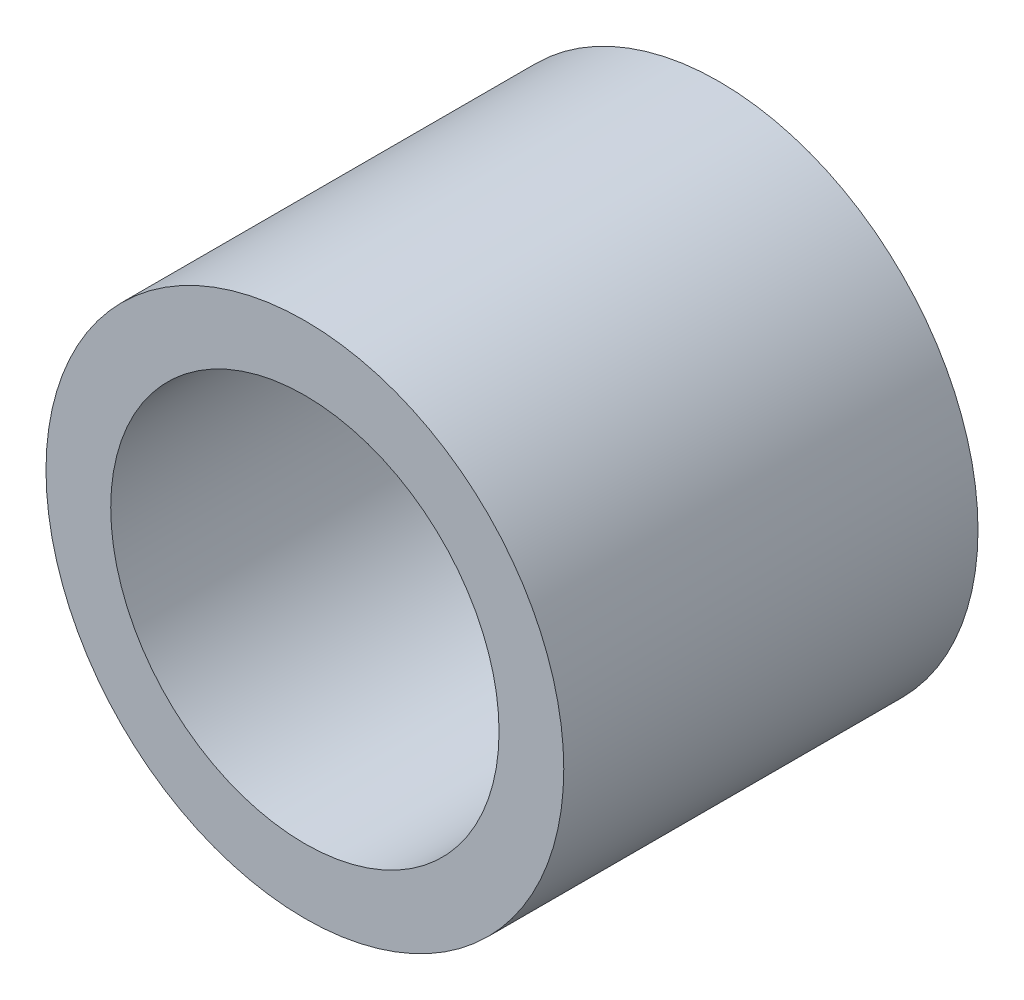
ISO-10303-21;
HEADER;
FILE_DESCRIPTION(('STEP AP214'),'2;1');
FILE_NAME('part.step','',(''),(''),'','','');
FILE_SCHEMA(('AUTOMOTIVE_DESIGN { 1 0 10303 214 1 1 1 1 }'));
ENDSEC;
DATA;
#1=APPLICATION_CONTEXT('core data for automotive mechanical design processes');
#2=APPLICATION_PROTOCOL_DEFINITION('international standard','automotive_design',2000,#1);
#3=PRODUCT_CONTEXT('',#1,'mechanical');
#4=PRODUCT('Part','Part','',(#3));
#5=PRODUCT_RELATED_PRODUCT_CATEGORY('part','',(#4));
#6=PRODUCT_DEFINITION_FORMATION('','',#4);
#7=PRODUCT_DEFINITION_CONTEXT('part definition',#1,'design');
#8=PRODUCT_DEFINITION('design','',#6,#7);
#9=PRODUCT_DEFINITION_SHAPE('','',#8);
#10=(LENGTH_UNIT() NAMED_UNIT(*) SI_UNIT(.MILLI.,.METRE.));
#11=(NAMED_UNIT(*) PLANE_ANGLE_UNIT() SI_UNIT($,.RADIAN.));
#12=(NAMED_UNIT(*) SI_UNIT($,.STERADIAN.) SOLID_ANGLE_UNIT());
#13=UNCERTAINTY_MEASURE_WITH_UNIT(LENGTH_MEASURE(1.E-05),#10,'distance_accuracy_value','');
#14=(GEOMETRIC_REPRESENTATION_CONTEXT(3) GLOBAL_UNCERTAINTY_ASSIGNED_CONTEXT((#13)) GLOBAL_UNIT_ASSIGNED_CONTEXT((#10,
#11,#12)) REPRESENTATION_CONTEXT('',''));
#15=CARTESIAN_POINT('',(0.,0.,0.));
#16=DIRECTION('',(0.,0.,1.));
#17=DIRECTION('',(1.,0.,0.));
#18=AXIS2_PLACEMENT_3D('',#15,#16,#17);
#19=CARTESIAN_POINT('',(0.,0.,3.2));
#20=DIRECTION('',(0.,0.,-1.));
#21=DIRECTION('',(-1.,0.,0.));
#22=AXIS2_PLACEMENT_3D('',#19,#20,#21);
#23=CYLINDRICAL_SURFACE('',#22,1.5);
#24=CARTESIAN_POINT('',(0.,0.,3.2));
#25=DIRECTION('',(0.,0.,1.));
#26=DIRECTION('',(1.,0.,0.));
#27=AXIS2_PLACEMENT_3D('',#24,#25,#26);
#28=CIRCLE('',#27,1.5);
#29=CARTESIAN_POINT('',(1.5,0.,3.2));
#30=VERTEX_POINT('',#29);
#31=EDGE_CURVE('E53',#30,#30,#28,.T.);
#32=ORIENTED_EDGE('',*,*,#31,.T.);
#33=EDGE_LOOP('',(#32));
#34=FACE_BOUND('',#33,.T.);
#35=CARTESIAN_POINT('',(0.,0.,0.));
#36=DIRECTION('',(0.,0.,1.));
#37=DIRECTION('',(1.,0.,0.));
#38=AXIS2_PLACEMENT_3D('',#35,#36,#37);
#39=CIRCLE('',#38,1.5);
#40=CARTESIAN_POINT('',(1.5,0.,0.));
#41=VERTEX_POINT('',#40);
#42=EDGE_CURVE('E60',#41,#41,#39,.T.);
#43=ORIENTED_EDGE('',*,*,#42,.F.);
#44=EDGE_LOOP('',(#43));
#45=FACE_BOUND('',#44,.T.);
#46=ADVANCED_FACE('F45',(#34,#45),#23,.F.);
#47=CARTESIAN_POINT('',(0.,0.,3.2));
#48=DIRECTION('',(0.,0.,-1.));
#49=DIRECTION('',(-1.,0.,0.));
#50=AXIS2_PLACEMENT_3D('',#47,#48,#49);
#51=CYLINDRICAL_SURFACE('',#50,2.);
#52=CARTESIAN_POINT('',(0.,0.,3.2));
#53=DIRECTION('',(0.,0.,1.));
#54=DIRECTION('',(1.,0.,0.));
#55=AXIS2_PLACEMENT_3D('',#52,#53,#54);
#56=CIRCLE('',#55,2.);
#57=CARTESIAN_POINT('',(2.,0.,3.2));
#58=VERTEX_POINT('',#57);
#59=EDGE_CURVE('E10',#58,#58,#56,.T.);
#60=ORIENTED_EDGE('',*,*,#59,.F.);
#61=EDGE_LOOP('',(#60));
#62=FACE_BOUND('',#61,.T.);
#63=CARTESIAN_POINT('',(0.,0.,0.));
#64=DIRECTION('',(0.,0.,1.));
#65=DIRECTION('',(1.,0.,0.));
#66=AXIS2_PLACEMENT_3D('',#63,#64,#65);
#67=CIRCLE('',#66,2.);
#68=CARTESIAN_POINT('',(2.,0.,0.));
#69=VERTEX_POINT('',#68);
#70=EDGE_CURVE('E48',#69,#69,#67,.T.);
#71=ORIENTED_EDGE('',*,*,#70,.T.);
#72=EDGE_LOOP('',(#71));
#73=FACE_BOUND('',#72,.T.);
#74=ADVANCED_FACE('F69',(#62,#73),#51,.T.);
#75=CARTESIAN_POINT('',(0.,0.,3.2));
#76=DIRECTION('',(0.,0.,1.));
#77=DIRECTION('',(1.,0.,0.));
#78=AXIS2_PLACEMENT_3D('',#75,#76,#77);
#79=PLANE('',#78);
#80=ORIENTED_EDGE('',*,*,#31,.F.);
#81=EDGE_LOOP('',(#80));
#82=FACE_BOUND('',#81,.T.);
#83=ORIENTED_EDGE('',*,*,#59,.T.);
#84=EDGE_LOOP('',(#83));
#85=FACE_BOUND('',#84,.T.);
#86=ADVANCED_FACE('F73',(#82,#85),#79,.T.);
#87=CARTESIAN_POINT('',(0.,0.,0.));
#88=DIRECTION('',(0.,0.,1.));
#89=DIRECTION('',(1.,0.,0.));
#90=AXIS2_PLACEMENT_3D('',#87,#88,#89);
#91=PLANE('',#90);
#92=ORIENTED_EDGE('',*,*,#42,.T.);
#93=EDGE_LOOP('',(#92));
#94=FACE_BOUND('',#93,.T.);
#95=ORIENTED_EDGE('',*,*,#70,.F.);
#96=EDGE_LOOP('',(#95));
#97=FACE_BOUND('',#96,.T.);
#98=ADVANCED_FACE('F71',(#94,#97),#91,.F.);
#99=CLOSED_SHELL('',(#46,#74,#86,#98));
#100=MANIFOLD_SOLID_BREP('B2',#99);
#101=ADVANCED_BREP_SHAPE_REPRESENTATION('',(#18,#100),#14);
#102=SHAPE_DEFINITION_REPRESENTATION(#9,#101);
ENDSEC;
END-ISO-10303-21;
